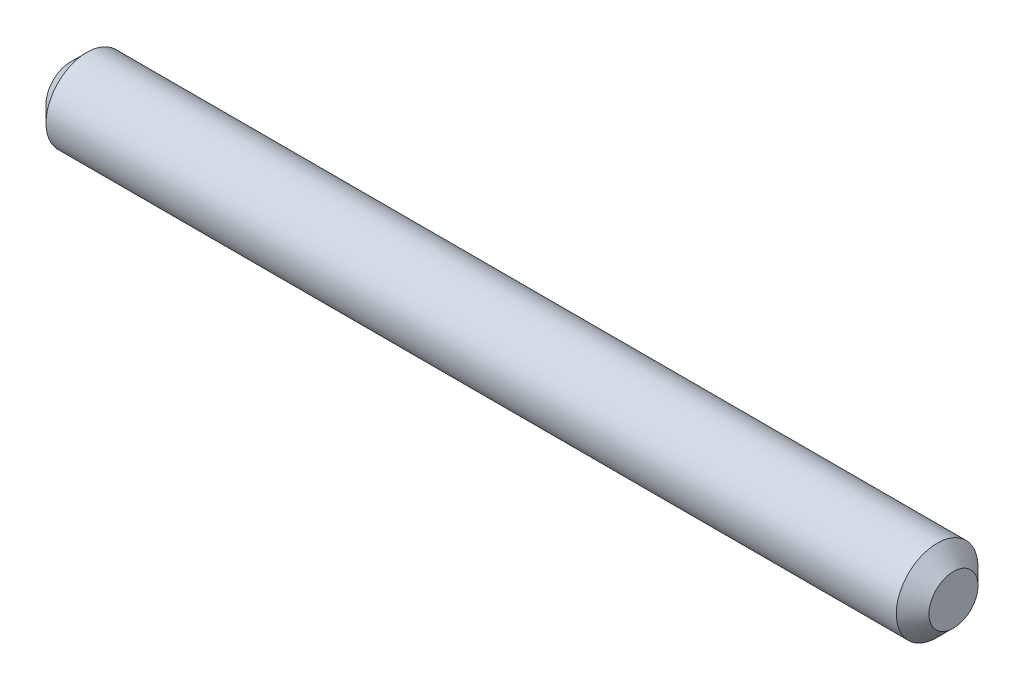
ISO-10303-21;
HEADER;
FILE_DESCRIPTION(('STEP AP214'),'2;1');
FILE_NAME('part.step','',(''),(''),'','','');
FILE_SCHEMA(('AUTOMOTIVE_DESIGN { 1 0 10303 214 1 1 1 1 }'));
ENDSEC;
DATA;
#1=APPLICATION_CONTEXT('core data for automotive mechanical design processes');
#2=APPLICATION_PROTOCOL_DEFINITION('international standard','automotive_design',2000,#1);
#3=PRODUCT_CONTEXT('',#1,'mechanical');
#4=PRODUCT('Part','Part','',(#3));
#5=PRODUCT_RELATED_PRODUCT_CATEGORY('part','',(#4));
#6=PRODUCT_DEFINITION_FORMATION('','',#4);
#7=PRODUCT_DEFINITION_CONTEXT('part definition',#1,'design');
#8=PRODUCT_DEFINITION('design','',#6,#7);
#9=PRODUCT_DEFINITION_SHAPE('','',#8);
#10=(LENGTH_UNIT() NAMED_UNIT(*) SI_UNIT(.MILLI.,.METRE.));
#11=(NAMED_UNIT(*) PLANE_ANGLE_UNIT() SI_UNIT($,.RADIAN.));
#12=(NAMED_UNIT(*) SI_UNIT($,.STERADIAN.) SOLID_ANGLE_UNIT());
#13=UNCERTAINTY_MEASURE_WITH_UNIT(LENGTH_MEASURE(1.E-05),#10,'distance_accuracy_value','');
#14=(GEOMETRIC_REPRESENTATION_CONTEXT(3) GLOBAL_UNCERTAINTY_ASSIGNED_CONTEXT((#13)) GLOBAL_UNIT_ASSIGNED_CONTEXT((#10,
#11,#12)) REPRESENTATION_CONTEXT('',''));
#15=CARTESIAN_POINT('',(0.,0.,0.));
#16=DIRECTION('',(0.,0.,1.));
#17=DIRECTION('',(1.,0.,0.));
#18=AXIS2_PLACEMENT_3D('',#15,#16,#17);
#19=CARTESIAN_POINT('',(-11.1752477857956,0.,0.));
#20=DIRECTION('',(1.,0.,0.));
#21=DIRECTION('',(0.,0.,-1.));
#22=AXIS2_PLACEMENT_3D('',#19,#20,#21);
#23=PLANE('',#22);
#24=CARTESIAN_POINT('',(-11.1752477857956,0.,0.));
#25=DIRECTION('',(-1.,0.,0.));
#26=DIRECTION('',(0.,0.,1.));
#27=AXIS2_PLACEMENT_3D('',#24,#25,#26);
#28=CIRCLE('',#27,1.5);
#29=CARTESIAN_POINT('',(-11.1752477857956,0.,1.5));
#30=VERTEX_POINT('',#29);
#31=EDGE_CURVE('E10',#30,#30,#28,.T.);
#32=ORIENTED_EDGE('',*,*,#31,.T.);
#33=EDGE_LOOP('',(#32));
#34=FACE_BOUND('',#33,.T.);
#35=ADVANCED_FACE('F35',(#34),#23,.F.);
#36=CARTESIAN_POINT('',(-10.1752477857956,0.,0.));
#37=DIRECTION('',(1.,0.,0.));
#38=DIRECTION('',(0.,0.,-1.));
#39=AXIS2_PLACEMENT_3D('',#36,#37,#38);
#40=CONICAL_SURFACE('',#39,2.5,0.78539816339745);
#41=ORIENTED_EDGE('',*,*,#31,.F.);
#42=EDGE_LOOP('',(#41));
#43=FACE_BOUND('',#42,.T.);
#44=CARTESIAN_POINT('',(-10.1752477857956,0.,0.));
#45=DIRECTION('',(-1.,0.,0.));
#46=DIRECTION('',(0.,0.,1.));
#47=AXIS2_PLACEMENT_3D('',#44,#45,#46);
#48=CIRCLE('',#47,2.5);
#49=CARTESIAN_POINT('',(-10.1752477857956,0.,2.5));
#50=VERTEX_POINT('',#49);
#51=EDGE_CURVE('E41',#50,#50,#48,.T.);
#52=ORIENTED_EDGE('',*,*,#51,.T.);
#53=EDGE_LOOP('',(#52));
#54=FACE_BOUND('',#53,.T.);
#55=ADVANCED_FACE('F67',(#43,#54),#40,.T.);
#56=CARTESIAN_POINT('',(-26.0823378684448,0.,0.));
#57=DIRECTION('',(-1.,0.,0.));
#58=DIRECTION('',(0.,0.,1.));
#59=AXIS2_PLACEMENT_3D('',#56,#57,#58);
#60=CYLINDRICAL_SURFACE('',#59,2.5);
#61=ORIENTED_EDGE('',*,*,#51,.F.);
#62=EDGE_LOOP('',(#61));
#63=FACE_BOUND('',#62,.T.);
#64=CARTESIAN_POINT('',(41.8247522142044,0.,0.));
#65=DIRECTION('',(-1.,0.,0.));
#66=DIRECTION('',(0.,0.,1.));
#67=AXIS2_PLACEMENT_3D('',#64,#65,#66);
#68=CIRCLE('',#67,2.5);
#69=CARTESIAN_POINT('',(41.8247522142044,0.,2.5));
#70=VERTEX_POINT('',#69);
#71=EDGE_CURVE('E45',#70,#70,#68,.T.);
#72=ORIENTED_EDGE('',*,*,#71,.T.);
#73=EDGE_LOOP('',(#72));
#74=FACE_BOUND('',#73,.T.);
#75=ADVANCED_FACE('F63',(#63,#74),#60,.T.);
#76=CARTESIAN_POINT('',(42.8247522142044,0.,0.));
#77=DIRECTION('',(-1.,0.,0.));
#78=DIRECTION('',(0.,0.,1.));
#79=AXIS2_PLACEMENT_3D('',#76,#77,#78);
#80=CONICAL_SURFACE('',#79,1.49999999999999,0.785398163397452);
#81=ORIENTED_EDGE('',*,*,#71,.F.);
#82=EDGE_LOOP('',(#81));
#83=FACE_BOUND('',#82,.T.);
#84=CARTESIAN_POINT('',(42.8247522142044,0.,0.));
#85=DIRECTION('',(-1.,0.,0.));
#86=DIRECTION('',(0.,0.,1.));
#87=AXIS2_PLACEMENT_3D('',#84,#85,#86);
#88=CIRCLE('',#87,1.49999999999999);
#89=CARTESIAN_POINT('',(42.8247522142044,0.,1.49999999999999));
#90=VERTEX_POINT('',#89);
#91=EDGE_CURVE('E49',#90,#90,#88,.T.);
#92=ORIENTED_EDGE('',*,*,#91,.T.);
#93=EDGE_LOOP('',(#92));
#94=FACE_BOUND('',#93,.T.);
#95=ADVANCED_FACE('F55',(#83,#94),#80,.T.);
#96=CARTESIAN_POINT('',(42.8247522142044,1.49999999999999,0.));
#97=DIRECTION('',(-1.,0.,0.));
#98=DIRECTION('',(0.,0.,1.));
#99=AXIS2_PLACEMENT_3D('',#96,#97,#98);
#100=PLANE('',#99);
#101=ORIENTED_EDGE('',*,*,#91,.F.);
#102=EDGE_LOOP('',(#101));
#103=FACE_BOUND('',#102,.T.);
#104=ADVANCED_FACE('F57',(#103),#100,.F.);
#105=CLOSED_SHELL('',(#35,#55,#75,#95,#104));
#106=MANIFOLD_SOLID_BREP('B2',#105);
#107=ADVANCED_BREP_SHAPE_REPRESENTATION('',(#18,#106),#14);
#108=SHAPE_DEFINITION_REPRESENTATION(#9,#107);
ENDSEC;
END-ISO-10303-21;
